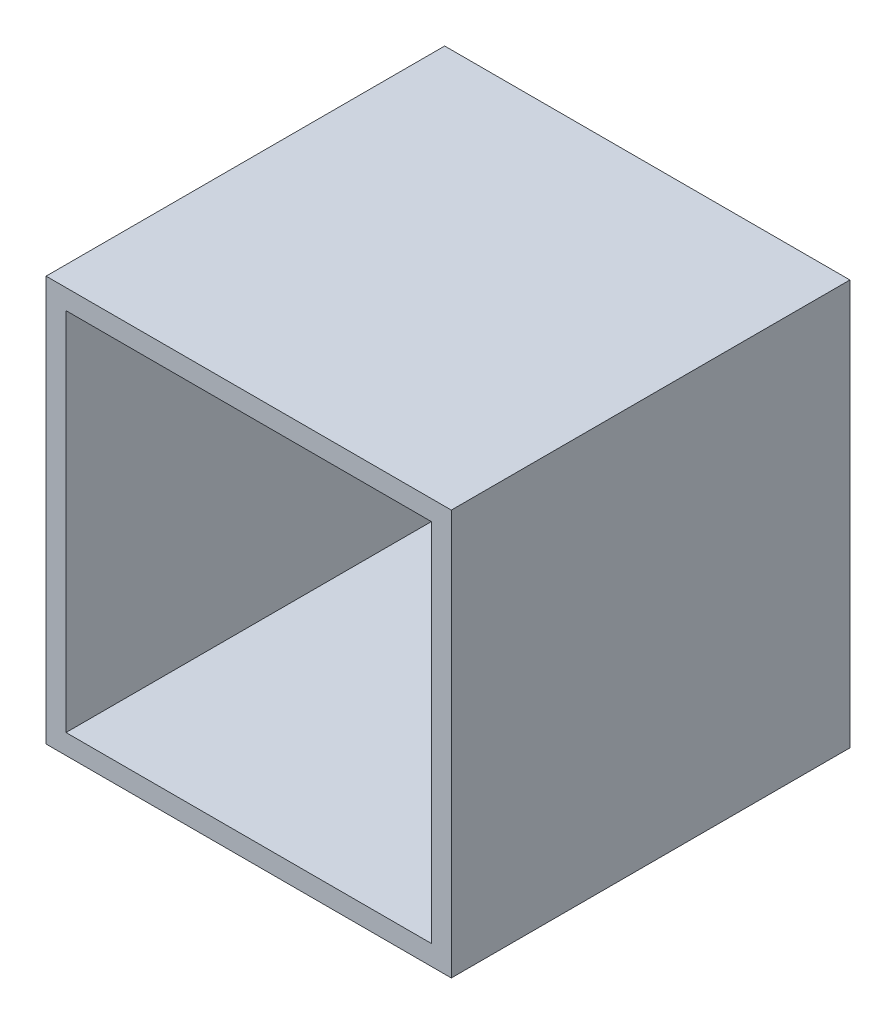
ISO-10303-21;
HEADER;
FILE_DESCRIPTION(('STEP AP214'),'2;1');
FILE_NAME('part.step','',(''),(''),'','','');
FILE_SCHEMA(('AUTOMOTIVE_DESIGN { 1 0 10303 214 1 1 1 1 }'));
ENDSEC;
DATA;
#1=APPLICATION_CONTEXT('core data for automotive mechanical design processes');
#2=APPLICATION_PROTOCOL_DEFINITION('international standard','automotive_design',2000,#1);
#3=PRODUCT_CONTEXT('',#1,'mechanical');
#4=PRODUCT('Part','Part','',(#3));
#5=PRODUCT_RELATED_PRODUCT_CATEGORY('part','',(#4));
#6=PRODUCT_DEFINITION_FORMATION('','',#4);
#7=PRODUCT_DEFINITION_CONTEXT('part definition',#1,'design');
#8=PRODUCT_DEFINITION('design','',#6,#7);
#9=PRODUCT_DEFINITION_SHAPE('','',#8);
#10=(LENGTH_UNIT() NAMED_UNIT(*) SI_UNIT(.MILLI.,.METRE.));
#11=(NAMED_UNIT(*) PLANE_ANGLE_UNIT() SI_UNIT($,.RADIAN.));
#12=(NAMED_UNIT(*) SI_UNIT($,.STERADIAN.) SOLID_ANGLE_UNIT());
#13=UNCERTAINTY_MEASURE_WITH_UNIT(LENGTH_MEASURE(1.E-05),#10,'distance_accuracy_value','');
#14=(GEOMETRIC_REPRESENTATION_CONTEXT(3) GLOBAL_UNCERTAINTY_ASSIGNED_CONTEXT((#13)) GLOBAL_UNIT_ASSIGNED_CONTEXT((#10,
#11,#12)) REPRESENTATION_CONTEXT('',''));
#15=CARTESIAN_POINT('',(0.,0.,0.));
#16=DIRECTION('',(0.,0.,1.));
#17=DIRECTION('',(1.,0.,0.));
#18=AXIS2_PLACEMENT_3D('',#15,#16,#17);
#19=CARTESIAN_POINT('',(27.5,-27.5,60.));
#20=DIRECTION('',(-1.,0.,0.));
#21=DIRECTION('',(0.,0.,1.));
#22=AXIS2_PLACEMENT_3D('',#19,#20,#21);
#23=PLANE('',#22);
#24=DIRECTION('',(0.,0.,-1.));
#25=VECTOR('',#24,1.);
#26=CARTESIAN_POINT('',(27.5,27.5,60.));
#27=LINE('',#26,#25);
#28=CARTESIAN_POINT('',(27.5,27.5,60.));
#29=VERTEX_POINT('',#28);
#30=CARTESIAN_POINT('',(27.5,27.5,3.));
#31=VERTEX_POINT('',#30);
#32=EDGE_CURVE('E108',#29,#31,#27,.T.);
#33=ORIENTED_EDGE('',*,*,#32,.T.);
#34=DIRECTION('',(0.,-1.,0.));
#35=VECTOR('',#34,1.);
#36=CARTESIAN_POINT('',(27.5,-27.5,3.));
#37=LINE('',#36,#35);
#38=CARTESIAN_POINT('',(27.5,-27.5,3.));
#39=VERTEX_POINT('',#38);
#40=EDGE_CURVE('E99',#31,#39,#37,.T.);
#41=ORIENTED_EDGE('',*,*,#40,.T.);
#42=DIRECTION('',(0.,0.,-1.));
#43=VECTOR('',#42,1.);
#44=CARTESIAN_POINT('',(27.5,-27.5,60.));
#45=LINE('',#44,#43);
#46=CARTESIAN_POINT('',(27.5,-27.5,60.));
#47=VERTEX_POINT('',#46);
#48=EDGE_CURVE('E105',#47,#39,#45,.T.);
#49=ORIENTED_EDGE('',*,*,#48,.F.);
#50=DIRECTION('',(0.,1.,0.));
#51=VECTOR('',#50,1.);
#52=CARTESIAN_POINT('',(27.5,-27.5,60.));
#53=LINE('',#52,#51);
#54=EDGE_CURVE('E109',#47,#29,#53,.T.);
#55=ORIENTED_EDGE('',*,*,#54,.T.);
#56=EDGE_LOOP('',(#33,#41,#49,#55));
#57=FACE_BOUND('',#56,.T.);
#58=ADVANCED_FACE('F36',(#57),#23,.T.);
#59=CARTESIAN_POINT('',(-27.5,27.5,60.));
#60=DIRECTION('',(0.,-1.,0.));
#61=DIRECTION('',(0.,0.,-1.));
#62=AXIS2_PLACEMENT_3D('',#59,#60,#61);
#63=PLANE('',#62);
#64=DIRECTION('',(0.,0.,-1.));
#65=VECTOR('',#64,1.);
#66=CARTESIAN_POINT('',(-27.5,27.5,60.));
#67=LINE('',#66,#65);
#68=CARTESIAN_POINT('',(-27.5,27.5,60.));
#69=VERTEX_POINT('',#68);
#70=CARTESIAN_POINT('',(-27.5,27.5,3.));
#71=VERTEX_POINT('',#70);
#72=EDGE_CURVE('E116',#69,#71,#67,.T.);
#73=ORIENTED_EDGE('',*,*,#72,.T.);
#74=DIRECTION('',(1.,0.,0.));
#75=VECTOR('',#74,1.);
#76=CARTESIAN_POINT('',(-27.5,27.5,3.));
#77=LINE('',#76,#75);
#78=EDGE_CURVE('E110',#71,#31,#77,.T.);
#79=ORIENTED_EDGE('',*,*,#78,.T.);
#80=ORIENTED_EDGE('',*,*,#32,.F.);
#81=DIRECTION('',(-1.,0.,0.));
#82=VECTOR('',#81,1.);
#83=CARTESIAN_POINT('',(-27.5,27.5,60.));
#84=LINE('',#83,#82);
#85=EDGE_CURVE('E178',#29,#69,#84,.T.);
#86=ORIENTED_EDGE('',*,*,#85,.T.);
#87=EDGE_LOOP('',(#73,#79,#80,#86));
#88=FACE_BOUND('',#87,.T.);
#89=ADVANCED_FACE('F239',(#88),#63,.T.);
#90=CARTESIAN_POINT('',(-27.5,-27.5,60.));
#91=DIRECTION('',(1.,0.,0.));
#92=DIRECTION('',(0.,0.,-1.));
#93=AXIS2_PLACEMENT_3D('',#90,#91,#92);
#94=PLANE('',#93);
#95=DIRECTION('',(0.,0.,-1.));
#96=VECTOR('',#95,1.);
#97=CARTESIAN_POINT('',(-27.5,-27.5,60.));
#98=LINE('',#97,#96);
#99=CARTESIAN_POINT('',(-27.5,-27.5,60.));
#100=VERTEX_POINT('',#99);
#101=CARTESIAN_POINT('',(-27.5,-27.5,3.));
#102=VERTEX_POINT('',#101);
#103=EDGE_CURVE('E57',#100,#102,#98,.T.);
#104=ORIENTED_EDGE('',*,*,#103,.T.);
#105=DIRECTION('',(0.,1.,0.));
#106=VECTOR('',#105,1.);
#107=CARTESIAN_POINT('',(-27.5,-27.5,3.));
#108=LINE('',#107,#106);
#109=EDGE_CURVE('E51',#102,#71,#108,.T.);
#110=ORIENTED_EDGE('',*,*,#109,.T.);
#111=ORIENTED_EDGE('',*,*,#72,.F.);
#112=DIRECTION('',(0.,-1.,0.));
#113=VECTOR('',#112,1.);
#114=CARTESIAN_POINT('',(-27.5,-27.5,60.));
#115=LINE('',#114,#113);
#116=EDGE_CURVE('E118',#69,#100,#115,.T.);
#117=ORIENTED_EDGE('',*,*,#116,.T.);
#118=EDGE_LOOP('',(#104,#110,#111,#117));
#119=FACE_BOUND('',#118,.T.);
#120=ADVANCED_FACE('F244',(#119),#94,.T.);
#121=CARTESIAN_POINT('',(-27.5,-27.5,60.));
#122=DIRECTION('',(0.,1.,0.));
#123=DIRECTION('',(0.,0.,1.));
#124=AXIS2_PLACEMENT_3D('',#121,#122,#123);
#125=PLANE('',#124);
#126=ORIENTED_EDGE('',*,*,#48,.T.);
#127=DIRECTION('',(-1.,0.,0.));
#128=VECTOR('',#127,1.);
#129=CARTESIAN_POINT('',(-27.5,-27.5,3.));
#130=LINE('',#129,#128);
#131=EDGE_CURVE('E11',#39,#102,#130,.T.);
#132=ORIENTED_EDGE('',*,*,#131,.T.);
#133=ORIENTED_EDGE('',*,*,#103,.F.);
#134=DIRECTION('',(1.,0.,0.));
#135=VECTOR('',#134,1.);
#136=CARTESIAN_POINT('',(-27.5,-27.5,60.));
#137=LINE('',#136,#135);
#138=EDGE_CURVE('E114',#100,#47,#137,.T.);
#139=ORIENTED_EDGE('',*,*,#138,.T.);
#140=EDGE_LOOP('',(#126,#132,#133,#139));
#141=FACE_BOUND('',#140,.T.);
#142=ADVANCED_FACE('F112',(#141),#125,.T.);
#143=CARTESIAN_POINT('',(0.,0.,60.));
#144=DIRECTION('',(0.,0.,1.));
#145=DIRECTION('',(1.,0.,0.));
#146=AXIS2_PLACEMENT_3D('',#143,#144,#145);
#147=PLANE('',#146);
#148=DIRECTION('',(1.,0.,0.));
#149=VECTOR('',#148,1.);
#150=CARTESIAN_POINT('',(-30.5,-30.5,60.));
#151=LINE('',#150,#149);
#152=CARTESIAN_POINT('',(-30.5,-30.5,60.));
#153=VERTEX_POINT('',#152);
#154=CARTESIAN_POINT('',(30.5,-30.5,60.));
#155=VERTEX_POINT('',#154);
#156=EDGE_CURVE('E126',#153,#155,#151,.T.);
#157=ORIENTED_EDGE('',*,*,#156,.T.);
#158=DIRECTION('',(0.,1.,0.));
#159=VECTOR('',#158,1.);
#160=CARTESIAN_POINT('',(30.5,-30.5,60.));
#161=LINE('',#160,#159);
#162=CARTESIAN_POINT('',(30.5,30.5,60.));
#163=VERTEX_POINT('',#162);
#164=EDGE_CURVE('E129',#155,#163,#161,.T.);
#165=ORIENTED_EDGE('',*,*,#164,.T.);
#166=DIRECTION('',(-1.,0.,0.));
#167=VECTOR('',#166,1.);
#168=CARTESIAN_POINT('',(-30.5,30.5,60.));
#169=LINE('',#168,#167);
#170=CARTESIAN_POINT('',(-30.5,30.5,60.));
#171=VERTEX_POINT('',#170);
#172=EDGE_CURVE('E132',#163,#171,#169,.T.);
#173=ORIENTED_EDGE('',*,*,#172,.T.);
#174=DIRECTION('',(0.,-1.,0.));
#175=VECTOR('',#174,1.);
#176=CARTESIAN_POINT('',(-30.5,-30.5,60.));
#177=LINE('',#176,#175);
#178=EDGE_CURVE('E134',#171,#153,#177,.T.);
#179=ORIENTED_EDGE('',*,*,#178,.T.);
#180=EDGE_LOOP('',(#157,#165,#173,#179));
#181=FACE_BOUND('',#180,.T.);
#182=ORIENTED_EDGE('',*,*,#85,.F.);
#183=ORIENTED_EDGE('',*,*,#54,.F.);
#184=ORIENTED_EDGE('',*,*,#138,.F.);
#185=ORIENTED_EDGE('',*,*,#116,.F.);
#186=EDGE_LOOP('',(#182,#183,#184,#185));
#187=FACE_BOUND('',#186,.T.);
#188=ADVANCED_FACE('F172',(#181,#187),#147,.T.);
#189=CARTESIAN_POINT('',(0.,0.,0.));
#190=DIRECTION('',(0.,0.,1.));
#191=DIRECTION('',(1.,0.,0.));
#192=AXIS2_PLACEMENT_3D('',#189,#190,#191);
#193=PLANE('',#192);
#194=CARTESIAN_POINT('',(14.,-11.,0.));
#195=DIRECTION('',(0.,0.,-1.));
#196=DIRECTION('',(-1.,0.,0.));
#197=AXIS2_PLACEMENT_3D('',#194,#195,#196);
#198=CIRCLE('',#197,1.5);
#199=CARTESIAN_POINT('',(12.5,-11.,0.));
#200=VERTEX_POINT('',#199);
#201=EDGE_CURVE('E200',#200,#200,#198,.T.);
#202=ORIENTED_EDGE('',*,*,#201,.F.);
#203=EDGE_LOOP('',(#202));
#204=FACE_BOUND('',#203,.T.);
#205=CARTESIAN_POINT('',(-14.,11.,0.));
#206=DIRECTION('',(0.,0.,-1.));
#207=DIRECTION('',(-1.,0.,0.));
#208=AXIS2_PLACEMENT_3D('',#205,#206,#207);
#209=CIRCLE('',#208,1.5);
#210=CARTESIAN_POINT('',(-15.5,11.,0.));
#211=VERTEX_POINT('',#210);
#212=EDGE_CURVE('E193',#211,#211,#209,.T.);
#213=ORIENTED_EDGE('',*,*,#212,.F.);
#214=EDGE_LOOP('',(#213));
#215=FACE_BOUND('',#214,.T.);
#216=CARTESIAN_POINT('',(14.,11.,0.));
#217=DIRECTION('',(0.,0.,-1.));
#218=DIRECTION('',(-1.,0.,0.));
#219=AXIS2_PLACEMENT_3D('',#216,#217,#218);
#220=CIRCLE('',#219,1.5);
#221=CARTESIAN_POINT('',(12.5,11.,0.));
#222=VERTEX_POINT('',#221);
#223=EDGE_CURVE('E205',#222,#222,#220,.T.);
#224=ORIENTED_EDGE('',*,*,#223,.F.);
#225=EDGE_LOOP('',(#224));
#226=FACE_BOUND('',#225,.T.);
#227=CARTESIAN_POINT('',(-14.,-11.,0.));
#228=DIRECTION('',(0.,0.,-1.));
#229=DIRECTION('',(-1.,0.,0.));
#230=AXIS2_PLACEMENT_3D('',#227,#228,#229);
#231=CIRCLE('',#230,1.5);
#232=CARTESIAN_POINT('',(-15.5,-11.,0.));
#233=VERTEX_POINT('',#232);
#234=EDGE_CURVE('E187',#233,#233,#231,.T.);
#235=ORIENTED_EDGE('',*,*,#234,.F.);
#236=EDGE_LOOP('',(#235));
#237=FACE_BOUND('',#236,.T.);
#238=DIRECTION('',(1.,0.,0.));
#239=VECTOR('',#238,1.);
#240=CARTESIAN_POINT('',(-30.5,-30.5,0.));
#241=LINE('',#240,#239);
#242=CARTESIAN_POINT('',(-30.5,-30.5,0.));
#243=VERTEX_POINT('',#242);
#244=CARTESIAN_POINT('',(30.5,-30.5,0.));
#245=VERTEX_POINT('',#244);
#246=EDGE_CURVE('E125',#243,#245,#241,.T.);
#247=ORIENTED_EDGE('',*,*,#246,.F.);
#248=DIRECTION('',(0.,-1.,0.));
#249=VECTOR('',#248,1.);
#250=CARTESIAN_POINT('',(-30.5,-30.5,0.));
#251=LINE('',#250,#249);
#252=CARTESIAN_POINT('',(-30.5,30.5,0.));
#253=VERTEX_POINT('',#252);
#254=EDGE_CURVE('E130',#253,#243,#251,.T.);
#255=ORIENTED_EDGE('',*,*,#254,.F.);
#256=DIRECTION('',(-1.,0.,0.));
#257=VECTOR('',#256,1.);
#258=CARTESIAN_POINT('',(-30.5,30.5,0.));
#259=LINE('',#258,#257);
#260=CARTESIAN_POINT('',(30.5,30.5,0.));
#261=VERTEX_POINT('',#260);
#262=EDGE_CURVE('E142',#261,#253,#259,.T.);
#263=ORIENTED_EDGE('',*,*,#262,.F.);
#264=DIRECTION('',(0.,1.,0.));
#265=VECTOR('',#264,1.);
#266=CARTESIAN_POINT('',(30.5,-30.5,0.));
#267=LINE('',#266,#265);
#268=EDGE_CURVE('E139',#245,#261,#267,.T.);
#269=ORIENTED_EDGE('',*,*,#268,.F.);
#270=EDGE_LOOP('',(#247,#255,#263,#269));
#271=FACE_BOUND('',#270,.T.);
#272=ADVANCED_FACE('F161',(#204,#215,#226,#237,#271),#193,.F.);
#273=CARTESIAN_POINT('',(-30.5,-30.5,60.));
#274=DIRECTION('',(0.,1.,0.));
#275=DIRECTION('',(0.,0.,1.));
#276=AXIS2_PLACEMENT_3D('',#273,#274,#275);
#277=PLANE('',#276);
#278=ORIENTED_EDGE('',*,*,#246,.T.);
#279=DIRECTION('',(0.,0.,-1.));
#280=VECTOR('',#279,1.);
#281=CARTESIAN_POINT('',(30.5,-30.5,60.));
#282=LINE('',#281,#280);
#283=EDGE_CURVE('E44',#155,#245,#282,.T.);
#284=ORIENTED_EDGE('',*,*,#283,.F.);
#285=ORIENTED_EDGE('',*,*,#156,.F.);
#286=DIRECTION('',(0.,0.,-1.));
#287=VECTOR('',#286,1.);
#288=CARTESIAN_POINT('',(-30.5,-30.5,60.));
#289=LINE('',#288,#287);
#290=EDGE_CURVE('E136',#153,#243,#289,.T.);
#291=ORIENTED_EDGE('',*,*,#290,.T.);
#292=EDGE_LOOP('',(#278,#284,#285,#291));
#293=FACE_BOUND('',#292,.T.);
#294=ADVANCED_FACE('F38',(#293),#277,.F.);
#295=CARTESIAN_POINT('',(30.5,-30.5,60.));
#296=DIRECTION('',(-1.,0.,0.));
#297=DIRECTION('',(0.,-1.,0.));
#298=AXIS2_PLACEMENT_3D('',#295,#296,#297);
#299=PLANE('',#298);
#300=ORIENTED_EDGE('',*,*,#268,.T.);
#301=DIRECTION('',(0.,0.,-1.));
#302=VECTOR('',#301,1.);
#303=CARTESIAN_POINT('',(30.5,30.5,60.));
#304=LINE('',#303,#302);
#305=EDGE_CURVE('E150',#163,#261,#304,.T.);
#306=ORIENTED_EDGE('',*,*,#305,.F.);
#307=ORIENTED_EDGE('',*,*,#164,.F.);
#308=ORIENTED_EDGE('',*,*,#283,.T.);
#309=EDGE_LOOP('',(#300,#306,#307,#308));
#310=FACE_BOUND('',#309,.T.);
#311=ADVANCED_FACE('F154',(#310),#299,.F.);
#312=CARTESIAN_POINT('',(-30.5,30.5,60.));
#313=DIRECTION('',(0.,-1.,0.));
#314=DIRECTION('',(0.,0.,-1.));
#315=AXIS2_PLACEMENT_3D('',#312,#313,#314);
#316=PLANE('',#315);
#317=ORIENTED_EDGE('',*,*,#262,.T.);
#318=DIRECTION('',(0.,0.,-1.));
#319=VECTOR('',#318,1.);
#320=CARTESIAN_POINT('',(-30.5,30.5,60.));
#321=LINE('',#320,#319);
#322=EDGE_CURVE('E148',#171,#253,#321,.T.);
#323=ORIENTED_EDGE('',*,*,#322,.F.);
#324=ORIENTED_EDGE('',*,*,#172,.F.);
#325=ORIENTED_EDGE('',*,*,#305,.T.);
#326=EDGE_LOOP('',(#317,#323,#324,#325));
#327=FACE_BOUND('',#326,.T.);
#328=ADVANCED_FACE('F170',(#327),#316,.F.);
#329=CARTESIAN_POINT('',(-30.5,-30.5,60.));
#330=DIRECTION('',(1.,0.,0.));
#331=DIRECTION('',(0.,0.,-1.));
#332=AXIS2_PLACEMENT_3D('',#329,#330,#331);
#333=PLANE('',#332);
#334=ORIENTED_EDGE('',*,*,#254,.T.);
#335=ORIENTED_EDGE('',*,*,#290,.F.);
#336=ORIENTED_EDGE('',*,*,#178,.F.);
#337=ORIENTED_EDGE('',*,*,#322,.T.);
#338=EDGE_LOOP('',(#334,#335,#336,#337));
#339=FACE_BOUND('',#338,.T.);
#340=ADVANCED_FACE('F166',(#339),#333,.F.);
#341=CARTESIAN_POINT('',(0.,0.,3.));
#342=DIRECTION('',(0.,0.,-1.));
#343=DIRECTION('',(-1.,0.,0.));
#344=AXIS2_PLACEMENT_3D('',#341,#342,#343);
#345=PLANE('',#344);
#346=CARTESIAN_POINT('',(14.,-11.,3.));
#347=DIRECTION('',(0.,0.,-1.));
#348=DIRECTION('',(-1.,0.,0.));
#349=AXIS2_PLACEMENT_3D('',#346,#347,#348);
#350=CIRCLE('',#349,1.5);
#351=CARTESIAN_POINT('',(12.5,-11.,3.));
#352=VERTEX_POINT('',#351);
#353=EDGE_CURVE('E190',#352,#352,#350,.T.);
#354=ORIENTED_EDGE('',*,*,#353,.T.);
#355=EDGE_LOOP('',(#354));
#356=FACE_BOUND('',#355,.T.);
#357=CARTESIAN_POINT('',(-14.,11.,3.));
#358=DIRECTION('',(0.,0.,-1.));
#359=DIRECTION('',(-1.,0.,0.));
#360=AXIS2_PLACEMENT_3D('',#357,#358,#359);
#361=CIRCLE('',#360,1.5);
#362=CARTESIAN_POINT('',(-15.5,11.,3.));
#363=VERTEX_POINT('',#362);
#364=EDGE_CURVE('E196',#363,#363,#361,.T.);
#365=ORIENTED_EDGE('',*,*,#364,.T.);
#366=EDGE_LOOP('',(#365));
#367=FACE_BOUND('',#366,.T.);
#368=CARTESIAN_POINT('',(14.,11.,3.));
#369=DIRECTION('',(0.,0.,-1.));
#370=DIRECTION('',(-1.,0.,0.));
#371=AXIS2_PLACEMENT_3D('',#368,#369,#370);
#372=CIRCLE('',#371,1.5);
#373=CARTESIAN_POINT('',(12.5,11.,3.));
#374=VERTEX_POINT('',#373);
#375=EDGE_CURVE('E197',#374,#374,#372,.T.);
#376=ORIENTED_EDGE('',*,*,#375,.T.);
#377=EDGE_LOOP('',(#376));
#378=FACE_BOUND('',#377,.T.);
#379=CARTESIAN_POINT('',(-14.,-11.,3.));
#380=DIRECTION('',(0.,0.,-1.));
#381=DIRECTION('',(-1.,0.,0.));
#382=AXIS2_PLACEMENT_3D('',#379,#380,#381);
#383=CIRCLE('',#382,1.5);
#384=CARTESIAN_POINT('',(-15.5,-11.,3.));
#385=VERTEX_POINT('',#384);
#386=EDGE_CURVE('E186',#385,#385,#383,.T.);
#387=ORIENTED_EDGE('',*,*,#386,.T.);
#388=EDGE_LOOP('',(#387));
#389=FACE_BOUND('',#388,.T.);
#390=ORIENTED_EDGE('',*,*,#40,.F.);
#391=ORIENTED_EDGE('',*,*,#78,.F.);
#392=ORIENTED_EDGE('',*,*,#109,.F.);
#393=ORIENTED_EDGE('',*,*,#131,.F.);
#394=EDGE_LOOP('',(#390,#391,#392,#393));
#395=FACE_BOUND('',#394,.T.);
#396=ADVANCED_FACE('F98',(#356,#367,#378,#389,#395),#345,.F.);
#397=CARTESIAN_POINT('',(-14.,-11.,3.));
#398=DIRECTION('',(0.,0.,-1.));
#399=DIRECTION('',(-1.,0.,0.));
#400=AXIS2_PLACEMENT_3D('',#397,#398,#399);
#401=CYLINDRICAL_SURFACE('',#400,1.5);
#402=ORIENTED_EDGE('',*,*,#386,.F.);
#403=EDGE_LOOP('',(#402));
#404=FACE_BOUND('',#403,.T.);
#405=ORIENTED_EDGE('',*,*,#234,.T.);
#406=EDGE_LOOP('',(#405));
#407=FACE_BOUND('',#406,.T.);
#408=ADVANCED_FACE('F217',(#404,#407),#401,.F.);
#409=CARTESIAN_POINT('',(14.,11.,3.));
#410=DIRECTION('',(0.,0.,-1.));
#411=DIRECTION('',(-1.,0.,0.));
#412=AXIS2_PLACEMENT_3D('',#409,#410,#411);
#413=CYLINDRICAL_SURFACE('',#412,1.5);
#414=ORIENTED_EDGE('',*,*,#375,.F.);
#415=EDGE_LOOP('',(#414));
#416=FACE_BOUND('',#415,.T.);
#417=ORIENTED_EDGE('',*,*,#223,.T.);
#418=EDGE_LOOP('',(#417));
#419=FACE_BOUND('',#418,.T.);
#420=ADVANCED_FACE('F213',(#416,#419),#413,.F.);
#421=CARTESIAN_POINT('',(-14.,11.,3.));
#422=DIRECTION('',(0.,0.,-1.));
#423=DIRECTION('',(-1.,0.,0.));
#424=AXIS2_PLACEMENT_3D('',#421,#422,#423);
#425=CYLINDRICAL_SURFACE('',#424,1.5);
#426=ORIENTED_EDGE('',*,*,#364,.F.);
#427=EDGE_LOOP('',(#426));
#428=FACE_BOUND('',#427,.T.);
#429=ORIENTED_EDGE('',*,*,#212,.T.);
#430=EDGE_LOOP('',(#429));
#431=FACE_BOUND('',#430,.T.);
#432=ADVANCED_FACE('F216',(#428,#431),#425,.F.);
#433=CARTESIAN_POINT('',(14.,-11.,3.));
#434=DIRECTION('',(0.,0.,-1.));
#435=DIRECTION('',(-1.,0.,0.));
#436=AXIS2_PLACEMENT_3D('',#433,#434,#435);
#437=CYLINDRICAL_SURFACE('',#436,1.5);
#438=ORIENTED_EDGE('',*,*,#353,.F.);
#439=EDGE_LOOP('',(#438));
#440=FACE_BOUND('',#439,.T.);
#441=ORIENTED_EDGE('',*,*,#201,.T.);
#442=EDGE_LOOP('',(#441));
#443=FACE_BOUND('',#442,.T.);
#444=ADVANCED_FACE('F316',(#440,#443),#437,.F.);
#445=CLOSED_SHELL('',(#58,#89,#120,#142,#188,#272,#294,#311,#328,#340,#396,#408,#420,#432,#444));
#446=MANIFOLD_SOLID_BREP('B2',#445);
#447=ADVANCED_BREP_SHAPE_REPRESENTATION('',(#18,#446),#14);
#448=SHAPE_DEFINITION_REPRESENTATION(#9,#447);
ENDSEC;
END-ISO-10303-21;
